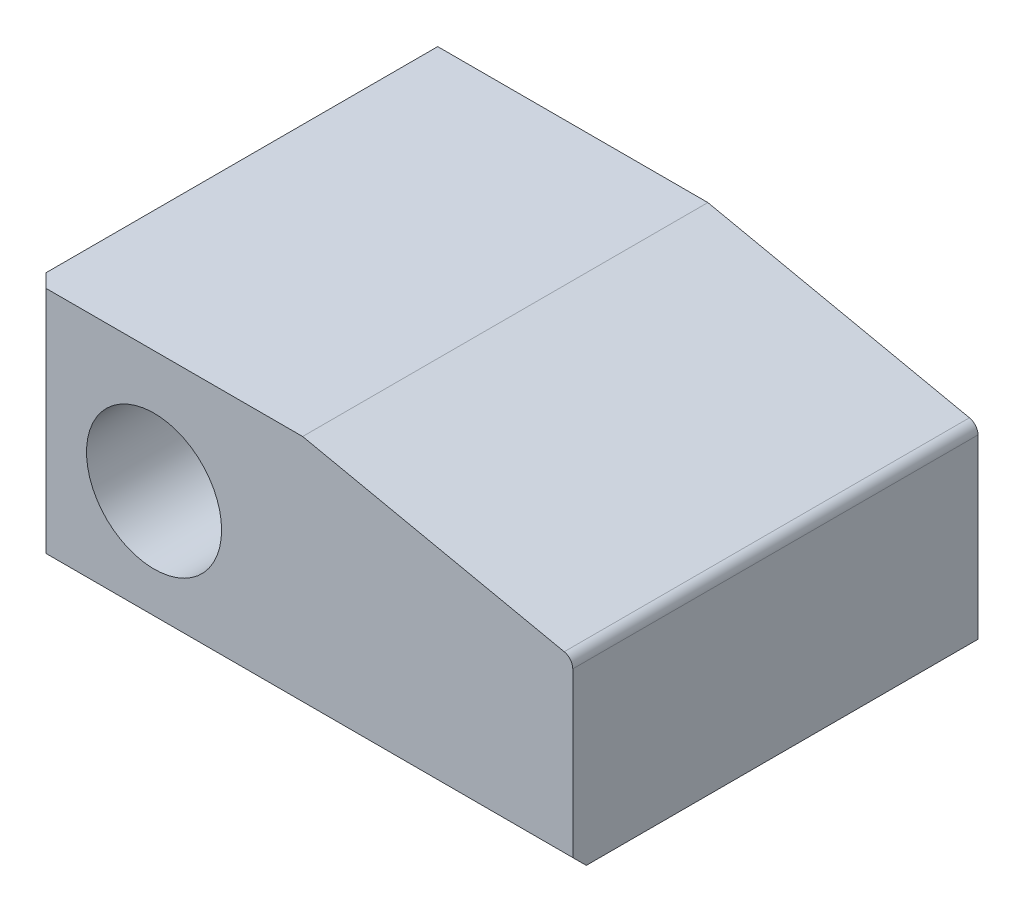
ISO-10303-21;
HEADER;
FILE_DESCRIPTION(('STEP AP214'),'2;1');
FILE_NAME('part.step','',(''),(''),'','','');
FILE_SCHEMA(('AUTOMOTIVE_DESIGN { 1 0 10303 214 1 1 1 1 }'));
ENDSEC;
DATA;
#1=APPLICATION_CONTEXT('core data for automotive mechanical design processes');
#2=APPLICATION_PROTOCOL_DEFINITION('international standard','automotive_design',2000,#1);
#3=PRODUCT_CONTEXT('',#1,'mechanical');
#4=PRODUCT('Part','Part','',(#3));
#5=PRODUCT_RELATED_PRODUCT_CATEGORY('part','',(#4));
#6=PRODUCT_DEFINITION_FORMATION('','',#4);
#7=PRODUCT_DEFINITION_CONTEXT('part definition',#1,'design');
#8=PRODUCT_DEFINITION('design','',#6,#7);
#9=PRODUCT_DEFINITION_SHAPE('','',#8);
#10=(LENGTH_UNIT() NAMED_UNIT(*) SI_UNIT(.MILLI.,.METRE.));
#11=(NAMED_UNIT(*) PLANE_ANGLE_UNIT() SI_UNIT($,.RADIAN.));
#12=(NAMED_UNIT(*) SI_UNIT($,.STERADIAN.) SOLID_ANGLE_UNIT());
#13=UNCERTAINTY_MEASURE_WITH_UNIT(LENGTH_MEASURE(1.E-05),#10,'distance_accuracy_value','');
#14=(GEOMETRIC_REPRESENTATION_CONTEXT(3) GLOBAL_UNCERTAINTY_ASSIGNED_CONTEXT((#13)) GLOBAL_UNIT_ASSIGNED_CONTEXT((#10,
#11,#12)) REPRESENTATION_CONTEXT('',''));
#15=CARTESIAN_POINT('',(0.,0.,0.));
#16=DIRECTION('',(0.,0.,1.));
#17=DIRECTION('',(1.,0.,0.));
#18=AXIS2_PLACEMENT_3D('',#15,#16,#17);
#19=CARTESIAN_POINT('',(0.,0.,15.));
#20=DIRECTION('',(0.,0.,1.));
#21=DIRECTION('',(1.,0.,0.));
#22=AXIS2_PLACEMENT_3D('',#19,#20,#21);
#23=PLANE('',#22);
#24=DIRECTION('',(0.,-1.,0.));
#25=VECTOR('',#24,1.);
#26=CARTESIAN_POINT('',(-4.,-4.5,15.));
#27=LINE('',#26,#25);
#28=CARTESIAN_POINT('',(-4.,4.5,15.));
#29=VERTEX_POINT('',#28);
#30=CARTESIAN_POINT('',(-4.,-4.,15.));
#31=VERTEX_POINT('',#30);
#32=EDGE_CURVE('E156',#29,#31,#27,.T.);
#33=ORIENTED_EDGE('',*,*,#32,.T.);
#34=DIRECTION('',(1.,0.,0.));
#35=VECTOR('',#34,1.);
#36=CARTESIAN_POINT('',(15.5,-4.,15.));
#37=LINE('',#36,#35);
#38=CARTESIAN_POINT('',(15.5,-4.,15.));
#39=VERTEX_POINT('',#38);
#40=EDGE_CURVE('E162',#31,#39,#37,.T.);
#41=ORIENTED_EDGE('',*,*,#40,.T.);
#42=DIRECTION('',(0.,1.,0.));
#43=VECTOR('',#42,1.);
#44=CARTESIAN_POINT('',(15.5,2.37443438329977,15.));
#45=LINE('',#44,#43);
#46=CARTESIAN_POINT('',(15.5,2.05052077002177,15.));
#47=VERTEX_POINT('',#46);
#48=EDGE_CURVE('E120',#39,#47,#45,.T.);
#49=ORIENTED_EDGE('',*,*,#48,.T.);
#50=CARTESIAN_POINT('',(15.1,2.05052077002177,15.));
#51=DIRECTION('',(0.,0.,1.));
#52=DIRECTION('',(1.,0.,0.));
#53=AXIS2_PLACEMENT_3D('',#50,#51,#52);
#54=CIRCLE('',#53,0.4);
#55=CARTESIAN_POINT('',(15.1831646763271,2.44177981031529,15.));
#56=VERTEX_POINT('',#55);
#57=EDGE_CURVE('E113',#47,#56,#54,.T.);
#58=ORIENTED_EDGE('',*,*,#57,.T.);
#59=DIRECTION('',(-0.978147600733806,0.20791169081776,0.));
#60=VECTOR('',#59,1.);
#61=CARTESIAN_POINT('',(5.5,4.5,15.));
#62=LINE('',#61,#60);
#63=CARTESIAN_POINT('',(5.5,4.5,15.));
#64=VERTEX_POINT('',#63);
#65=EDGE_CURVE('E106',#56,#64,#62,.T.);
#66=ORIENTED_EDGE('',*,*,#65,.T.);
#67=DIRECTION('',(-1.,0.,0.));
#68=VECTOR('',#67,1.);
#69=CARTESIAN_POINT('',(-4.5,4.5,15.));
#70=LINE('',#69,#68);
#71=EDGE_CURVE('E109',#64,#29,#70,.T.);
#72=ORIENTED_EDGE('',*,*,#71,.T.);
#73=EDGE_LOOP('',(#33,#41,#49,#58,#66,#72));
#74=FACE_BOUND('',#73,.T.);
#75=CARTESIAN_POINT('',(0.,0.,15.));
#76=DIRECTION('',(0.,0.,1.));
#77=DIRECTION('',(1.,0.,0.));
#78=AXIS2_PLACEMENT_3D('',#75,#76,#77);
#79=CIRCLE('',#78,2.5);
#80=CARTESIAN_POINT('',(2.5,0.,15.));
#81=VERTEX_POINT('',#80);
#82=EDGE_CURVE('E136',#81,#81,#79,.T.);
#83=ORIENTED_EDGE('',*,*,#82,.F.);
#84=EDGE_LOOP('',(#83));
#85=FACE_BOUND('',#84,.T.);
#86=ADVANCED_FACE('F43',(#74,#85),#23,.T.);
#87=CARTESIAN_POINT('',(0.,0.,0.));
#88=DIRECTION('',(0.,0.,1.));
#89=DIRECTION('',(1.,0.,0.));
#90=AXIS2_PLACEMENT_3D('',#87,#88,#89);
#91=PLANE('',#90);
#92=DIRECTION('',(-0.978147600733806,0.20791169081776,0.));
#93=VECTOR('',#92,1.);
#94=CARTESIAN_POINT('',(5.5,4.5,0.));
#95=LINE('',#94,#93);
#96=CARTESIAN_POINT('',(15.1831646763271,2.44177981031529,0.));
#97=VERTEX_POINT('',#96);
#98=CARTESIAN_POINT('',(5.5,4.5,0.));
#99=VERTEX_POINT('',#98);
#100=EDGE_CURVE('E124',#97,#99,#95,.T.);
#101=ORIENTED_EDGE('',*,*,#100,.F.);
#102=CARTESIAN_POINT('',(15.1,2.05052077002177,0.));
#103=DIRECTION('',(0.,0.,1.));
#104=DIRECTION('',(1.,0.,0.));
#105=AXIS2_PLACEMENT_3D('',#102,#103,#104);
#106=CIRCLE('',#105,0.4);
#107=CARTESIAN_POINT('',(15.5,2.05052077002177,0.));
#108=VERTEX_POINT('',#107);
#109=EDGE_CURVE('E152',#97,#108,#106,.F.);
#110=ORIENTED_EDGE('',*,*,#109,.T.);
#111=DIRECTION('',(0.,1.,0.));
#112=VECTOR('',#111,1.);
#113=CARTESIAN_POINT('',(15.5,2.37443438329977,0.));
#114=LINE('',#113,#112);
#115=CARTESIAN_POINT('',(15.5,-4.5,0.));
#116=VERTEX_POINT('',#115);
#117=EDGE_CURVE('E141',#116,#108,#114,.T.);
#118=ORIENTED_EDGE('',*,*,#117,.F.);
#119=DIRECTION('',(1.,0.,0.));
#120=VECTOR('',#119,1.);
#121=CARTESIAN_POINT('',(-4.5,-4.5,0.));
#122=LINE('',#121,#120);
#123=CARTESIAN_POINT('',(-4.5,-4.5,0.));
#124=VERTEX_POINT('',#123);
#125=EDGE_CURVE('E139',#124,#116,#122,.T.);
#126=ORIENTED_EDGE('',*,*,#125,.F.);
#127=DIRECTION('',(0.,-1.,0.));
#128=VECTOR('',#127,1.);
#129=CARTESIAN_POINT('',(-4.5,4.5,0.));
#130=LINE('',#129,#128);
#131=CARTESIAN_POINT('',(-4.5,4.5,0.));
#132=VERTEX_POINT('',#131);
#133=EDGE_CURVE('E137',#132,#124,#130,.T.);
#134=ORIENTED_EDGE('',*,*,#133,.F.);
#135=DIRECTION('',(-1.,0.,0.));
#136=VECTOR('',#135,1.);
#137=CARTESIAN_POINT('',(-4.5,4.5,0.));
#138=LINE('',#137,#136);
#139=EDGE_CURVE('E150',#99,#132,#138,.T.);
#140=ORIENTED_EDGE('',*,*,#139,.F.);
#141=EDGE_LOOP('',(#101,#110,#118,#126,#134,#140));
#142=FACE_BOUND('',#141,.T.);
#143=CARTESIAN_POINT('',(0.,0.,0.));
#144=DIRECTION('',(0.,0.,1.));
#145=DIRECTION('',(1.,0.,0.));
#146=AXIS2_PLACEMENT_3D('',#143,#144,#145);
#147=CIRCLE('',#146,2.5);
#148=CARTESIAN_POINT('',(2.5,0.,0.));
#149=VERTEX_POINT('',#148);
#150=EDGE_CURVE('E179',#149,#149,#147,.T.);
#151=ORIENTED_EDGE('',*,*,#150,.T.);
#152=EDGE_LOOP('',(#151));
#153=FACE_BOUND('',#152,.T.);
#154=ADVANCED_FACE('F192',(#142,#153),#91,.F.);
#155=CARTESIAN_POINT('',(-4.5,4.5,15.));
#156=DIRECTION('',(1.,0.,0.));
#157=DIRECTION('',(0.,0.,-1.));
#158=AXIS2_PLACEMENT_3D('',#155,#156,#157);
#159=PLANE('',#158);
#160=DIRECTION('',(0.,0.,-1.));
#161=VECTOR('',#160,1.);
#162=CARTESIAN_POINT('',(-4.5,-4.5,15.));
#163=LINE('',#162,#161);
#164=CARTESIAN_POINT('',(-4.5,-4.5,14.5));
#165=VERTEX_POINT('',#164);
#166=EDGE_CURVE('E146',#165,#124,#163,.T.);
#167=ORIENTED_EDGE('',*,*,#166,.F.);
#168=DIRECTION('',(0.,1.,0.));
#169=VECTOR('',#168,1.);
#170=CARTESIAN_POINT('',(-4.5,4.5,14.5));
#171=LINE('',#170,#169);
#172=CARTESIAN_POINT('',(-4.5,4.5,14.5));
#173=VERTEX_POINT('',#172);
#174=EDGE_CURVE('E52',#165,#173,#171,.T.);
#175=ORIENTED_EDGE('',*,*,#174,.T.);
#176=DIRECTION('',(0.,0.,-1.));
#177=VECTOR('',#176,1.);
#178=CARTESIAN_POINT('',(-4.5,4.5,15.));
#179=LINE('',#178,#177);
#180=EDGE_CURVE('E128',#173,#132,#179,.T.);
#181=ORIENTED_EDGE('',*,*,#180,.T.);
#182=ORIENTED_EDGE('',*,*,#133,.T.);
#183=EDGE_LOOP('',(#167,#175,#181,#182));
#184=FACE_BOUND('',#183,.T.);
#185=ADVANCED_FACE('F210',(#184),#159,.F.);
#186=CARTESIAN_POINT('',(-4.5,-4.5,15.));
#187=DIRECTION('',(0.,1.,0.));
#188=DIRECTION('',(0.,0.,1.));
#189=AXIS2_PLACEMENT_3D('',#186,#187,#188);
#190=PLANE('',#189);
#191=DIRECTION('',(0.,0.,-1.));
#192=VECTOR('',#191,1.);
#193=CARTESIAN_POINT('',(15.5,-4.5,15.));
#194=LINE('',#193,#192);
#195=CARTESIAN_POINT('',(15.5,-4.5,14.5));
#196=VERTEX_POINT('',#195);
#197=EDGE_CURVE('E130',#196,#116,#194,.T.);
#198=ORIENTED_EDGE('',*,*,#197,.F.);
#199=DIRECTION('',(-1.,0.,0.));
#200=VECTOR('',#199,1.);
#201=CARTESIAN_POINT('',(-4.5,-4.5,14.5));
#202=LINE('',#201,#200);
#203=EDGE_CURVE('E70',#196,#165,#202,.T.);
#204=ORIENTED_EDGE('',*,*,#203,.T.);
#205=ORIENTED_EDGE('',*,*,#166,.T.);
#206=ORIENTED_EDGE('',*,*,#125,.T.);
#207=EDGE_LOOP('',(#198,#204,#205,#206));
#208=FACE_BOUND('',#207,.T.);
#209=ADVANCED_FACE('F173',(#208),#190,.F.);
#210=CARTESIAN_POINT('',(15.5,2.37443438329977,15.));
#211=DIRECTION('',(-1.,0.,0.));
#212=DIRECTION('',(0.,0.,1.));
#213=AXIS2_PLACEMENT_3D('',#210,#211,#212);
#214=PLANE('',#213);
#215=ORIENTED_EDGE('',*,*,#48,.F.);
#216=DIRECTION('',(0.,-0.707106781186545,-0.70710678118655));
#217=VECTOR('',#216,1.);
#218=CARTESIAN_POINT('',(15.5,-4.,15.));
#219=LINE('',#218,#217);
#220=EDGE_CURVE('E164',#39,#196,#219,.T.);
#221=ORIENTED_EDGE('',*,*,#220,.T.);
#222=ORIENTED_EDGE('',*,*,#197,.T.);
#223=ORIENTED_EDGE('',*,*,#117,.T.);
#224=DIRECTION('',(0.,0.,-1.));
#225=VECTOR('',#224,1.);
#226=CARTESIAN_POINT('',(15.5,2.05052077002177,15.));
#227=LINE('',#226,#225);
#228=EDGE_CURVE('E157',#108,#47,#227,.F.);
#229=ORIENTED_EDGE('',*,*,#228,.T.);
#230=EDGE_LOOP('',(#215,#221,#222,#223,#229));
#231=FACE_BOUND('',#230,.T.);
#232=ADVANCED_FACE('F167',(#231),#214,.F.);
#233=CARTESIAN_POINT('',(5.5,4.5,15.));
#234=DIRECTION('',(-0.20791169081776,-0.978147600733805,0.));
#235=DIRECTION('',(0.978147600733806,-0.20791169081776,0.));
#236=AXIS2_PLACEMENT_3D('',#233,#234,#235);
#237=PLANE('',#236);
#238=ORIENTED_EDGE('',*,*,#65,.F.);
#239=DIRECTION('',(0.,0.,-1.));
#240=VECTOR('',#239,1.);
#241=CARTESIAN_POINT('',(15.1831646763271,2.44177981031529,15.));
#242=LINE('',#241,#240);
#243=EDGE_CURVE('E155',#56,#97,#242,.T.);
#244=ORIENTED_EDGE('',*,*,#243,.T.);
#245=ORIENTED_EDGE('',*,*,#100,.T.);
#246=DIRECTION('',(0.,0.,-1.));
#247=VECTOR('',#246,1.);
#248=CARTESIAN_POINT('',(5.5,4.5,15.));
#249=LINE('',#248,#247);
#250=EDGE_CURVE('E119',#64,#99,#249,.T.);
#251=ORIENTED_EDGE('',*,*,#250,.F.);
#252=EDGE_LOOP('',(#238,#244,#245,#251));
#253=FACE_BOUND('',#252,.T.);
#254=ADVANCED_FACE('F122',(#253),#237,.F.);
#255=CARTESIAN_POINT('',(-4.5,4.5,15.));
#256=DIRECTION('',(0.,-1.,0.));
#257=DIRECTION('',(0.,0.,-1.));
#258=AXIS2_PLACEMENT_3D('',#255,#256,#257);
#259=PLANE('',#258);
#260=ORIENTED_EDGE('',*,*,#180,.F.);
#261=DIRECTION('',(0.707106781186545,0.,0.70710678118655));
#262=VECTOR('',#261,1.);
#263=CARTESIAN_POINT('',(-4.,4.5,15.));
#264=LINE('',#263,#262);
#265=EDGE_CURVE('E11',#173,#29,#264,.T.);
#266=ORIENTED_EDGE('',*,*,#265,.T.);
#267=ORIENTED_EDGE('',*,*,#71,.F.);
#268=ORIENTED_EDGE('',*,*,#250,.T.);
#269=ORIENTED_EDGE('',*,*,#139,.T.);
#270=EDGE_LOOP('',(#260,#266,#267,#268,#269));
#271=FACE_BOUND('',#270,.T.);
#272=ADVANCED_FACE('F126',(#271),#259,.F.);
#273=CARTESIAN_POINT('',(0.,0.,15.));
#274=DIRECTION('',(0.,0.,-1.));
#275=DIRECTION('',(-1.,0.,0.));
#276=AXIS2_PLACEMENT_3D('',#273,#274,#275);
#277=CYLINDRICAL_SURFACE('',#276,2.5);
#278=ORIENTED_EDGE('',*,*,#82,.T.);
#279=EDGE_LOOP('',(#278));
#280=FACE_BOUND('',#279,.T.);
#281=ORIENTED_EDGE('',*,*,#150,.F.);
#282=EDGE_LOOP('',(#281));
#283=FACE_BOUND('',#282,.T.);
#284=ADVANCED_FACE('F197',(#280,#283),#277,.F.);
#285=CARTESIAN_POINT('',(15.1,2.05052077002177,15.));
#286=DIRECTION('',(0.,0.,-1.));
#287=DIRECTION('',(-1.,0.,0.));
#288=AXIS2_PLACEMENT_3D('',#285,#286,#287);
#289=CYLINDRICAL_SURFACE('',#288,0.4);
#290=ORIENTED_EDGE('',*,*,#57,.F.);
#291=ORIENTED_EDGE('',*,*,#228,.F.);
#292=ORIENTED_EDGE('',*,*,#109,.F.);
#293=ORIENTED_EDGE('',*,*,#243,.F.);
#294=EDGE_LOOP('',(#290,#291,#292,#293));
#295=FACE_BOUND('',#294,.T.);
#296=ADVANCED_FACE('F186',(#295),#289,.T.);
#297=CARTESIAN_POINT('',(-4.,0.,15.));
#298=DIRECTION('',(-0.70710678118655,0.,0.707106781186545));
#299=DIRECTION('',(0.,1.,0.));
#300=AXIS2_PLACEMENT_3D('',#297,#298,#299);
#301=PLANE('',#300);
#302=ORIENTED_EDGE('',*,*,#265,.F.);
#303=ORIENTED_EDGE('',*,*,#174,.F.);
#304=DIRECTION('',(0.577350269189624,0.577350269189624,0.577350269189628));
#305=VECTOR('',#304,1.);
#306=CARTESIAN_POINT('',(-2.66666666666667,-2.66666666666667,16.3333333333333));
#307=LINE('',#306,#305);
#308=EDGE_CURVE('E48',#31,#165,#307,.F.);
#309=ORIENTED_EDGE('',*,*,#308,.F.);
#310=ORIENTED_EDGE('',*,*,#32,.F.);
#311=EDGE_LOOP('',(#302,#303,#309,#310));
#312=FACE_BOUND('',#311,.T.);
#313=ADVANCED_FACE('F46',(#312),#301,.T.);
#314=CARTESIAN_POINT('',(0.,-4.,15.));
#315=DIRECTION('',(0.,-0.70710678118655,0.707106781186545));
#316=DIRECTION('',(-1.,0.,0.));
#317=AXIS2_PLACEMENT_3D('',#314,#315,#316);
#318=PLANE('',#317);
#319=ORIENTED_EDGE('',*,*,#308,.T.);
#320=ORIENTED_EDGE('',*,*,#203,.F.);
#321=ORIENTED_EDGE('',*,*,#220,.F.);
#322=ORIENTED_EDGE('',*,*,#40,.F.);
#323=EDGE_LOOP('',(#319,#320,#321,#322));
#324=FACE_BOUND('',#323,.T.);
#325=ADVANCED_FACE('F180',(#324),#318,.T.);
#326=CLOSED_SHELL('',(#86,#154,#185,#209,#232,#254,#272,#284,#296,#313,#325));
#327=MANIFOLD_SOLID_BREP('B2',#326);
#328=ADVANCED_BREP_SHAPE_REPRESENTATION('',(#18,#327),#14);
#329=SHAPE_DEFINITION_REPRESENTATION(#9,#328);
ENDSEC;
END-ISO-10303-21;
